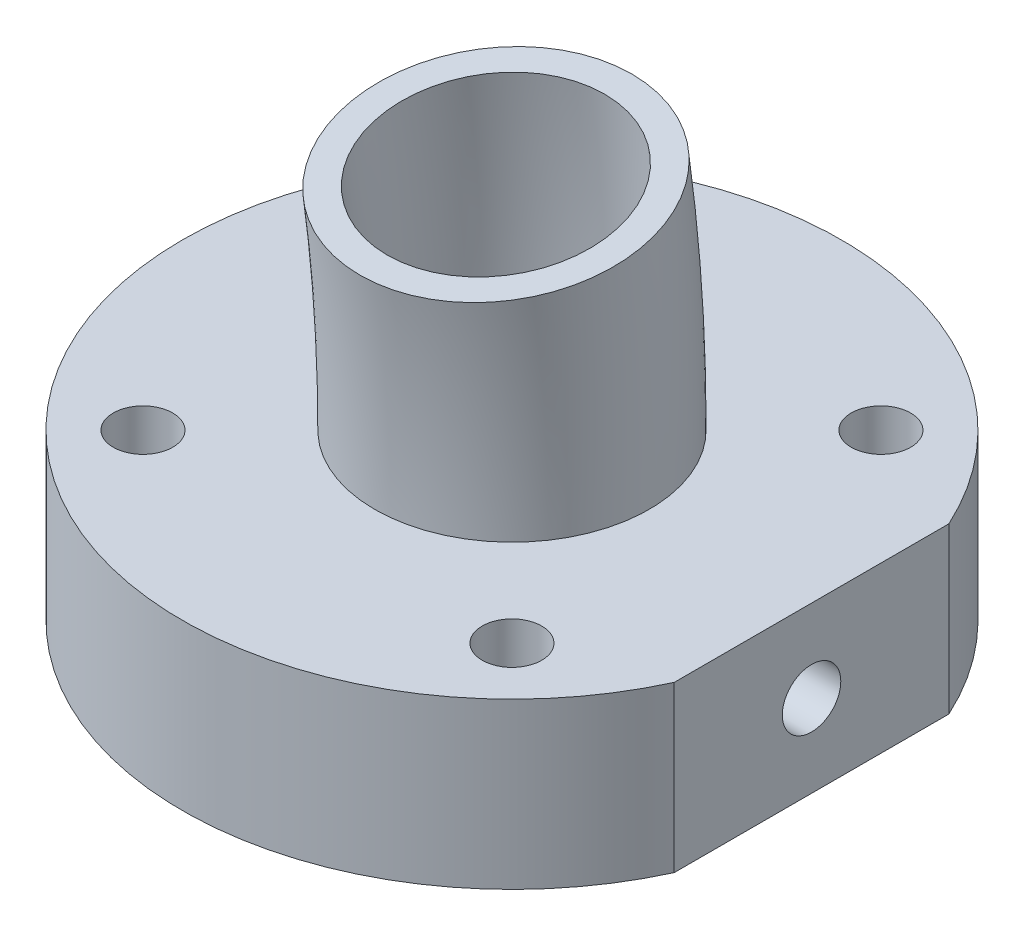
ISO-10303-21;
HEADER;
FILE_DESCRIPTION(('STEP AP214'),'2;1');
FILE_NAME('part.step','',(''),(''),'','','');
FILE_SCHEMA(('AUTOMOTIVE_DESIGN { 1 0 10303 214 1 1 1 1 }'));
ENDSEC;
DATA;
#1=APPLICATION_CONTEXT('core data for automotive mechanical design processes');
#2=APPLICATION_PROTOCOL_DEFINITION('international standard','automotive_design',2000,#1);
#3=PRODUCT_CONTEXT('',#1,'mechanical');
#4=PRODUCT('Part','Part','',(#3));
#5=PRODUCT_RELATED_PRODUCT_CATEGORY('part','',(#4));
#6=PRODUCT_DEFINITION_FORMATION('','',#4);
#7=PRODUCT_DEFINITION_CONTEXT('part definition',#1,'design');
#8=PRODUCT_DEFINITION('design','',#6,#7);
#9=PRODUCT_DEFINITION_SHAPE('','',#8);
#10=(LENGTH_UNIT() NAMED_UNIT(*) SI_UNIT(.MILLI.,.METRE.));
#11=(NAMED_UNIT(*) PLANE_ANGLE_UNIT() SI_UNIT($,.RADIAN.));
#12=(NAMED_UNIT(*) SI_UNIT($,.STERADIAN.) SOLID_ANGLE_UNIT());
#13=UNCERTAINTY_MEASURE_WITH_UNIT(LENGTH_MEASURE(1.E-05),#10,'distance_accuracy_value','');
#14=(GEOMETRIC_REPRESENTATION_CONTEXT(3) GLOBAL_UNCERTAINTY_ASSIGNED_CONTEXT((#13)) GLOBAL_UNIT_ASSIGNED_CONTEXT((#10,
#11,#12)) REPRESENTATION_CONTEXT('',''));
#15=CARTESIAN_POINT('',(0.,0.,0.));
#16=DIRECTION('',(0.,0.,1.));
#17=DIRECTION('',(1.,0.,0.));
#18=AXIS2_PLACEMENT_3D('',#15,#16,#17);
#19=CARTESIAN_POINT('',(27.7081287711747,15.24,12.7));
#20=DIRECTION('',(-1.,0.,0.));
#21=DIRECTION('',(0.,0.,1.));
#22=AXIS2_PLACEMENT_3D('',#19,#20,#21);
#23=PLANE('',#22);
#24=DIRECTION('',(0.,0.,-1.));
#25=VECTOR('',#24,1.);
#26=CARTESIAN_POINT('',(27.7081287711747,0.,12.7));
#27=LINE('',#26,#25);
#28=CARTESIAN_POINT('',(27.7081287711747,0.,12.7));
#29=VERTEX_POINT('',#28);
#30=CARTESIAN_POINT('',(27.7081287711747,0.,-12.7));
#31=VERTEX_POINT('',#30);
#32=EDGE_CURVE('E77',#29,#31,#27,.T.);
#33=ORIENTED_EDGE('',*,*,#32,.T.);
#34=DIRECTION('',(0.,-1.,0.));
#35=VECTOR('',#34,1.);
#36=CARTESIAN_POINT('',(27.7081287711747,15.24,-12.7));
#37=LINE('',#36,#35);
#38=CARTESIAN_POINT('',(27.7081287711747,15.24,-12.7));
#39=VERTEX_POINT('',#38);
#40=EDGE_CURVE('E73',#39,#31,#37,.T.);
#41=ORIENTED_EDGE('',*,*,#40,.F.);
#42=DIRECTION('',(0.,0.,-1.));
#43=VECTOR('',#42,1.);
#44=CARTESIAN_POINT('',(27.7081287711747,15.24,12.7));
#45=LINE('',#44,#43);
#46=CARTESIAN_POINT('',(27.7081287711747,15.24,12.7));
#47=VERTEX_POINT('',#46);
#48=EDGE_CURVE('E83',#47,#39,#45,.T.);
#49=ORIENTED_EDGE('',*,*,#48,.F.);
#50=DIRECTION('',(0.,-1.,0.));
#51=VECTOR('',#50,1.);
#52=CARTESIAN_POINT('',(27.7081287711747,15.24,12.7));
#53=LINE('',#52,#51);
#54=EDGE_CURVE('E67',#47,#29,#53,.T.);
#55=ORIENTED_EDGE('',*,*,#54,.T.);
#56=EDGE_LOOP('',(#33,#41,#49,#55));
#57=FACE_BOUND('',#56,.T.);
#58=CARTESIAN_POINT('',(27.7081287711747,7.62,0.));
#59=DIRECTION('',(1.,0.,0.));
#60=DIRECTION('',(0.,0.,-1.));
#61=AXIS2_PLACEMENT_3D('',#58,#59,#60);
#62=CIRCLE('',#61,2.7051);
#63=CARTESIAN_POINT('',(27.7081287711747,7.62,-2.7051));
#64=VERTEX_POINT('',#63);
#65=EDGE_CURVE('E210',#64,#64,#62,.T.);
#66=ORIENTED_EDGE('',*,*,#65,.F.);
#67=EDGE_LOOP('',(#66));
#68=FACE_BOUND('',#67,.T.);
#69=ADVANCED_FACE('F51',(#57,#68),#23,.F.);
#70=CARTESIAN_POINT('',(0.,15.24,0.));
#71=DIRECTION('',(0.,-1.,0.));
#72=DIRECTION('',(0.,0.,-1.));
#73=AXIS2_PLACEMENT_3D('',#70,#71,#72);
#74=CYLINDRICAL_SURFACE('',#73,30.48);
#75=CARTESIAN_POINT('',(0.,15.24,0.));
#76=DIRECTION('',(0.,1.,0.));
#77=DIRECTION('',(0.,0.,1.));
#78=AXIS2_PLACEMENT_3D('',#75,#76,#77);
#79=CIRCLE('',#78,30.48);
#80=EDGE_CURVE('E90',#39,#47,#79,.T.);
#81=ORIENTED_EDGE('',*,*,#80,.F.);
#82=ORIENTED_EDGE('',*,*,#40,.T.);
#83=CARTESIAN_POINT('',(0.,0.,0.));
#84=DIRECTION('',(0.,1.,0.));
#85=DIRECTION('',(0.,0.,1.));
#86=AXIS2_PLACEMENT_3D('',#83,#84,#85);
#87=CIRCLE('',#86,30.48);
#88=EDGE_CURVE('E88',#31,#29,#87,.T.);
#89=ORIENTED_EDGE('',*,*,#88,.T.);
#90=ORIENTED_EDGE('',*,*,#54,.F.);
#91=EDGE_LOOP('',(#81,#82,#89,#90));
#92=FACE_BOUND('',#91,.T.);
#93=ADVANCED_FACE('F53',(#92),#74,.T.);
#94=CARTESIAN_POINT('',(0.,15.24,0.));
#95=DIRECTION('',(0.,1.,0.));
#96=DIRECTION('',(0.,0.,1.));
#97=AXIS2_PLACEMENT_3D('',#94,#95,#96);
#98=PLANE('',#97);
#99=CARTESIAN_POINT('',(0.,15.24,0.));
#100=DIRECTION('',(0.,1.,0.));
#101=DIRECTION('',(0.,0.,1.));
#102=AXIS2_PLACEMENT_3D('',#99,#100,#101);
#103=CIRCLE('',#102,12.7);
#104=CARTESIAN_POINT('',(0.,15.24,-12.7));
#105=VERTEX_POINT('',#104);
#106=EDGE_CURVE('E197',#105,#105,#103,.T.);
#107=ORIENTED_EDGE('',*,*,#106,.F.);
#108=EDGE_LOOP('',(#107));
#109=FACE_BOUND('',#108,.T.);
#110=ORIENTED_EDGE('',*,*,#48,.T.);
#111=ORIENTED_EDGE('',*,*,#80,.T.);
#112=EDGE_LOOP('',(#110,#111));
#113=FACE_BOUND('',#112,.T.);
#114=CARTESIAN_POINT('',(-17.0624866300316,15.24,-17.0624866300312));
#115=DIRECTION('',(0.,-1.,0.));
#116=DIRECTION('',(0.,0.,-1.));
#117=AXIS2_PLACEMENT_3D('',#114,#115,#116);
#118=CIRCLE('',#117,2.75);
#119=CARTESIAN_POINT('',(-17.0624866300316,15.24,-19.8124866300312));
#120=VERTEX_POINT('',#119);
#121=EDGE_CURVE('E158',#120,#120,#118,.T.);
#122=ORIENTED_EDGE('',*,*,#121,.T.);
#123=EDGE_LOOP('',(#122));
#124=FACE_BOUND('',#123,.T.);
#125=CARTESIAN_POINT('',(17.0624866300314,15.24,-17.0624866300314));
#126=DIRECTION('',(0.,-1.,0.));
#127=DIRECTION('',(0.,0.,-1.));
#128=AXIS2_PLACEMENT_3D('',#125,#126,#127);
#129=CIRCLE('',#128,2.75);
#130=CARTESIAN_POINT('',(17.0624866300314,15.24,-19.8124866300314));
#131=VERTEX_POINT('',#130);
#132=EDGE_CURVE('E152',#131,#131,#129,.T.);
#133=ORIENTED_EDGE('',*,*,#132,.T.);
#134=EDGE_LOOP('',(#133));
#135=FACE_BOUND('',#134,.T.);
#136=CARTESIAN_POINT('',(17.0624866300315,15.24,17.0624866300313));
#137=DIRECTION('',(0.,-1.,0.));
#138=DIRECTION('',(0.,0.,-1.));
#139=AXIS2_PLACEMENT_3D('',#136,#137,#138);
#140=CIRCLE('',#139,2.75);
#141=CARTESIAN_POINT('',(17.0624866300315,15.24,14.3124866300313));
#142=VERTEX_POINT('',#141);
#143=EDGE_CURVE('E146',#142,#142,#140,.T.);
#144=ORIENTED_EDGE('',*,*,#143,.T.);
#145=EDGE_LOOP('',(#144));
#146=FACE_BOUND('',#145,.T.);
#147=CARTESIAN_POINT('',(-17.0624866300314,15.24,17.0624866300314));
#148=DIRECTION('',(0.,-1.,0.));
#149=DIRECTION('',(0.,0.,-1.));
#150=AXIS2_PLACEMENT_3D('',#147,#148,#149);
#151=CIRCLE('',#150,2.75);
#152=CARTESIAN_POINT('',(-17.0624866300314,15.24,14.3124866300314));
#153=VERTEX_POINT('',#152);
#154=EDGE_CURVE('E138',#153,#153,#151,.T.);
#155=ORIENTED_EDGE('',*,*,#154,.T.);
#156=EDGE_LOOP('',(#155));
#157=FACE_BOUND('',#156,.T.);
#158=ADVANCED_FACE('F113',(#109,#113,#124,#135,#146,#157),#98,.T.);
#159=CARTESIAN_POINT('',(0.,0.,0.));
#160=DIRECTION('',(0.,1.,0.));
#161=DIRECTION('',(0.,0.,1.));
#162=AXIS2_PLACEMENT_3D('',#159,#160,#161);
#163=PLANE('',#162);
#164=CARTESIAN_POINT('',(0.,0.,-22.86));
#165=DIRECTION('',(0.,1.,0.));
#166=DIRECTION('',(0.,0.,1.));
#167=AXIS2_PLACEMENT_3D('',#164,#165,#166);
#168=CIRCLE('',#167,2.54);
#169=CARTESIAN_POINT('',(0.,0.,-20.32));
#170=VERTEX_POINT('',#169);
#171=EDGE_CURVE('E11',#170,#170,#168,.F.);
#172=ORIENTED_EDGE('',*,*,#171,.F.);
#173=EDGE_LOOP('',(#172));
#174=FACE_BOUND('',#173,.T.);
#175=CARTESIAN_POINT('',(-21.7411519625072,0.,7.06412849141139));
#176=DIRECTION('',(0.,-1.,0.));
#177=DIRECTION('',(0.,0.,1.));
#178=AXIS2_PLACEMENT_3D('',#175,#176,#177);
#179=CIRCLE('',#178,2.5908);
#180=CARTESIAN_POINT('',(-21.7411519625072,0.,4.47332849141139));
#181=VERTEX_POINT('',#180);
#182=EDGE_CURVE('E178',#181,#181,#179,.T.);
#183=ORIENTED_EDGE('',*,*,#182,.F.);
#184=EDGE_LOOP('',(#183));
#185=FACE_BOUND('',#184,.T.);
#186=CARTESIAN_POINT('',(0.,0.,22.86));
#187=DIRECTION('',(0.,1.,0.));
#188=DIRECTION('',(0.,0.,1.));
#189=AXIS2_PLACEMENT_3D('',#186,#187,#188);
#190=CIRCLE('',#189,2.54);
#191=CARTESIAN_POINT('',(0.,0.,25.4));
#192=VERTEX_POINT('',#191);
#193=EDGE_CURVE('E60',#192,#192,#190,.F.);
#194=ORIENTED_EDGE('',*,*,#193,.F.);
#195=EDGE_LOOP('',(#194));
#196=FACE_BOUND('',#195,.T.);
#197=CARTESIAN_POINT('',(21.7411519625072,0.,-7.06412849141139));
#198=DIRECTION('',(0.,-1.,0.));
#199=DIRECTION('',(0.,0.,-1.));
#200=AXIS2_PLACEMENT_3D('',#197,#198,#199);
#201=CIRCLE('',#200,2.5908);
#202=CARTESIAN_POINT('',(21.7411519625072,0.,-9.65492849141139));
#203=VERTEX_POINT('',#202);
#204=EDGE_CURVE('E118',#203,#203,#201,.T.);
#205=ORIENTED_EDGE('',*,*,#204,.F.);
#206=EDGE_LOOP('',(#205));
#207=FACE_BOUND('',#206,.T.);
#208=CARTESIAN_POINT('',(-17.0624866300316,0.,-17.0624866300312));
#209=DIRECTION('',(0.,-1.,0.));
#210=DIRECTION('',(0.,0.,-1.));
#211=AXIS2_PLACEMENT_3D('',#208,#209,#210);
#212=CIRCLE('',#211,2.74999999999999);
#213=CARTESIAN_POINT('',(-17.0624866300316,0.,-19.8124866300312));
#214=VERTEX_POINT('',#213);
#215=EDGE_CURVE('E92',#214,#214,#212,.T.);
#216=ORIENTED_EDGE('',*,*,#215,.F.);
#217=EDGE_LOOP('',(#216));
#218=FACE_BOUND('',#217,.T.);
#219=CARTESIAN_POINT('',(17.0624866300314,0.,-17.0624866300314));
#220=DIRECTION('',(0.,-1.,0.));
#221=DIRECTION('',(0.,0.,-1.));
#222=AXIS2_PLACEMENT_3D('',#219,#220,#221);
#223=CIRCLE('',#222,2.74999999999999);
#224=CARTESIAN_POINT('',(17.0624866300314,0.,-19.8124866300314));
#225=VERTEX_POINT('',#224);
#226=EDGE_CURVE('E125',#225,#225,#223,.T.);
#227=ORIENTED_EDGE('',*,*,#226,.F.);
#228=EDGE_LOOP('',(#227));
#229=FACE_BOUND('',#228,.T.);
#230=CARTESIAN_POINT('',(17.0624866300315,0.,17.0624866300313));
#231=DIRECTION('',(0.,-1.,0.));
#232=DIRECTION('',(0.,0.,-1.));
#233=AXIS2_PLACEMENT_3D('',#230,#231,#232);
#234=CIRCLE('',#233,2.74999999999999);
#235=CARTESIAN_POINT('',(17.0624866300315,0.,14.3124866300313));
#236=VERTEX_POINT('',#235);
#237=EDGE_CURVE('E129',#236,#236,#234,.T.);
#238=ORIENTED_EDGE('',*,*,#237,.F.);
#239=EDGE_LOOP('',(#238));
#240=FACE_BOUND('',#239,.T.);
#241=CARTESIAN_POINT('',(-17.0624866300314,0.,17.0624866300314));
#242=DIRECTION('',(0.,-1.,0.));
#243=DIRECTION('',(0.,0.,-1.));
#244=AXIS2_PLACEMENT_3D('',#241,#242,#243);
#245=CIRCLE('',#244,2.74999999999999);
#246=CARTESIAN_POINT('',(-17.0624866300314,0.,14.3124866300314));
#247=VERTEX_POINT('',#246);
#248=EDGE_CURVE('E133',#247,#247,#245,.T.);
#249=ORIENTED_EDGE('',*,*,#248,.F.);
#250=EDGE_LOOP('',(#249));
#251=FACE_BOUND('',#250,.T.);
#252=CARTESIAN_POINT('',(0.,0.,0.));
#253=DIRECTION('',(0.,1.,0.));
#254=DIRECTION('',(0.,0.,1.));
#255=AXIS2_PLACEMENT_3D('',#252,#253,#254);
#256=CIRCLE('',#255,10.16);
#257=CARTESIAN_POINT('',(0.,0.,10.16));
#258=VERTEX_POINT('',#257);
#259=EDGE_CURVE('E102',#258,#258,#256,.T.);
#260=ORIENTED_EDGE('',*,*,#259,.T.);
#261=EDGE_LOOP('',(#260));
#262=FACE_BOUND('',#261,.T.);
#263=ORIENTED_EDGE('',*,*,#88,.F.);
#264=ORIENTED_EDGE('',*,*,#32,.F.);
#265=EDGE_LOOP('',(#263,#264));
#266=FACE_BOUND('',#265,.T.);
#267=ADVANCED_FACE('F94',(#174,#185,#196,#207,#218,#229,#240,#251,#262,#266),#163,.F.);
#268=CARTESIAN_POINT('',(0.,0.,0.));
#269=DIRECTION('',(0.,1.,0.));
#270=DIRECTION('',(0.,0.,1.));
#271=AXIS2_PLACEMENT_3D('',#268,#269,#270);
#272=CYLINDRICAL_SURFACE('',#271,10.16);
#273=CARTESIAN_POINT('',(9.79326472582049,7.62,-2.7051));
#274=CARTESIAN_POINT('',(9.7932673171211,7.76902770791751,-2.70509638863618));
#275=CARTESIAN_POINT('',(9.79670362492512,7.91809368698344,-2.69274283114542));
#276=CARTESIAN_POINT('',(9.81003660575043,8.21192123164599,-2.64374829179006));
#277=CARTESIAN_POINT('',(9.81993653309732,8.35668059052267,-2.60709507530541));
#278=CARTESIAN_POINT('',(9.8449978131649,8.63760184480197,-2.51079093511335));
#279=CARTESIAN_POINT('',(9.86015178054885,8.77377549282811,-2.45117227976283));
#280=CARTESIAN_POINT('',(9.89400425688689,9.03420908511249,-2.31073062232269));
#281=CARTESIAN_POINT('',(9.91270303800144,9.15846811349718,-2.229905991917));
#282=CARTESIAN_POINT('',(9.95206070242859,9.39464374035677,-2.04719172318244));
#283=CARTESIAN_POINT('',(9.97275425074444,9.50621926343222,-1.94486858829938));
#284=CARTESIAN_POINT('',(10.0134705647841,9.71084578731823,-1.7229942257539));
#285=CARTESIAN_POINT('',(10.0334932609663,9.80389487255655,-1.60344121878061));
#286=CARTESIAN_POINT('',(10.070998585387,9.97024878481681,-1.34813648253075));
#287=CARTESIAN_POINT('',(10.0884355517653,10.0432146335225,-1.21215658806797));
#288=CARTESIAN_POINT('',(10.1184070538741,10.1651203105704,-0.92931765340531));
#289=CARTESIAN_POINT('',(10.1309424135114,10.2140641770997,-0.782460446503641));
#290=CARTESIAN_POINT('',(10.1494531922373,10.2854329756945,-0.485595620147637));
#291=CARTESIAN_POINT('',(10.1555719025094,10.3084380735988,-0.335736568786069));
#292=CARTESIAN_POINT('',(10.1610609254403,10.3291015050557,-0.0341695538225296));
#293=CARTESIAN_POINT('',(10.1604323641952,10.3267640681882,0.117538097033137));
#294=CARTESIAN_POINT('',(10.1526026968424,10.2972175582547,0.41445806043396));
#295=CARTESIAN_POINT('',(10.145567236689,10.2706352918592,0.559737781017194));
#296=CARTESIAN_POINT('',(10.1259096831883,10.1943661961507,0.843694971494757));
#297=CARTESIAN_POINT('',(10.11328727179,10.1446780514699,0.982372065020202));
#298=CARTESIAN_POINT('',(10.0836281894883,10.0231265556663,1.2507889195354));
#299=CARTESIAN_POINT('',(10.0665489932574,9.95104822808549,1.38042643722773));
#300=CARTESIAN_POINT('',(10.029816857918,9.78692736717324,1.62597998706135));
#301=CARTESIAN_POINT('',(10.0101634187932,9.6948809529918,1.74189334509734));
#302=CARTESIAN_POINT('',(9.9697032157213,9.49010860868201,1.96044936613881));
#303=CARTESIAN_POINT('',(9.94887956305702,9.37683597438144,2.06257727447672));
#304=CARTESIAN_POINT('',(9.90896882434699,9.1345561771736,2.24651281866579));
#305=CARTESIAN_POINT('',(9.88988184354636,9.00554806177818,2.32831922352013));
#306=CARTESIAN_POINT('',(9.85553801299677,8.73434586248696,2.46967985871337));
#307=CARTESIAN_POINT('',(9.84030536141952,8.59207578993692,2.52909459638092));
#308=CARTESIAN_POINT('',(9.81569583938117,8.29905933215482,2.62299399517633));
#309=CARTESIAN_POINT('',(9.80631752203602,8.1483150513495,2.65748481652005));
#310=CARTESIAN_POINT('',(9.79478664059017,7.84744229166619,2.69967075476614));
#311=CARTESIAN_POINT('',(9.79242712964987,7.6974292632193,2.70813356040159));
#312=CARTESIAN_POINT('',(9.79463489133088,7.39813163229968,2.70013801063646));
#313=CARTESIAN_POINT('',(9.79920142938915,7.24884695426408,2.68368229804483));
#314=CARTESIAN_POINT('',(9.81454690118514,6.95819885472521,2.62699350870605));
#315=CARTESIAN_POINT('',(9.82520525874523,6.81673850994501,2.58722155152418));
#316=CARTESIAN_POINT('',(9.85141573404922,6.54249629647809,2.48554754715659));
#317=CARTESIAN_POINT('',(9.86696848935198,6.4097155611462,2.42364261672063));
#318=CARTESIAN_POINT('',(9.90164040357705,6.15338881863973,2.2779001256088));
#319=CARTESIAN_POINT('',(9.9208302652827,6.03010903658356,2.1936115454663));
#320=CARTESIAN_POINT('',(9.96044764353482,5.79916152035475,2.00605376371391));
#321=CARTESIAN_POINT('',(9.98087539150268,5.69149671823002,1.90278100565026));
#322=CARTESIAN_POINT('',(10.0213790155131,5.4916505323391,1.67663623714533));
#323=CARTESIAN_POINT('',(10.0414278127842,5.40000439051528,1.55328541546095));
#324=CARTESIAN_POINT('',(10.0783107077549,5.23871946386713,1.29250478628731));
#325=CARTESIAN_POINT('',(10.0951449765232,5.16907950780243,1.15507572860299));
#326=CARTESIAN_POINT('',(10.1235936291924,5.05442223124288,0.871006867777265));
#327=CARTESIAN_POINT('',(10.1352468318643,5.00922123150742,0.724445277449876));
#328=CARTESIAN_POINT('',(10.1521911656474,4.94419153916506,0.425450157750773));
#329=CARTESIAN_POINT('',(10.1574837018989,4.92435724271578,0.273017932947812));
#330=CARTESIAN_POINT('',(10.1610442586551,4.91097413481328,-0.02839025898668));
#331=CARTESIAN_POINT('',(10.1595221384301,4.91664006540924,-0.177329374587197));
#332=CARTESIAN_POINT('',(10.1500987588047,4.95227391508849,-0.472054187899851));
#333=CARTESIAN_POINT('',(10.1421977375863,4.9822409267936,-0.617840003144422));
#334=CARTESIAN_POINT('',(10.1209457384555,5.06518284960528,-0.901178475250264));
#335=CARTESIAN_POINT('',(10.1076324328625,5.11799887948469,-1.03878065425371));
#336=CARTESIAN_POINT('',(10.076948281487,5.24499767105314,-1.30324867864879));
#337=CARTESIAN_POINT('',(10.0595768681017,5.31918342203885,-1.4301130187667));
#338=CARTESIAN_POINT('',(10.0220589532015,5.48911654409842,-1.67316170275539));
#339=CARTESIAN_POINT('',(10.0018509358314,5.58538486659523,-1.78897229036808));
#340=CARTESIAN_POINT('',(9.96118703747031,5.79576178654122,-2.00306079102184));
#341=CARTESIAN_POINT('',(9.94073109271626,5.90987506728128,-2.10133408697913));
#342=CARTESIAN_POINT('',(9.9013716572321,6.1557097887659,-2.27968899872958));
#343=CARTESIAN_POINT('',(9.88251198493108,6.28776216371631,-2.35932500292422));
#344=CARTESIAN_POINT('',(9.84909844120408,6.56386723448478,-2.49515230618985));
#345=CARTESIAN_POINT('',(9.83454174706155,6.70791198355749,-2.55135898466771));
#346=CARTESIAN_POINT('',(9.81340992264055,6.97952712118093,-2.63134824475336));
#347=CARTESIAN_POINT('',(9.8059164860361,7.10591693301025,-2.65894033709995));
#348=CARTESIAN_POINT('',(9.79584304203194,7.36152844899186,-2.69581674451383));
#349=CARTESIAN_POINT('',(9.79326247841264,7.49074983088713,-2.70510313209798));
#350=CARTESIAN_POINT('',(9.79326472582049,7.62,-2.7051));
#351=B_SPLINE_CURVE_WITH_KNOTS('',3,(#273,#274,#275,#276,#277,#278,#279,#280,#281,#282,#283,
#284,#285,#286,#287,#288,#289,#290,#291,#292,#293,#294,#295,#296,#297,#298,#299,#300,#301,#302,
#303,#304,#305,#306,#307,#308,#309,#310,#311,#312,#313,#314,#315,#316,#317,#318,#319,#320,#321,
#322,#323,#324,#325,#326,#327,#328,#329,#330,#331,#332,#333,#334,#335,#336,#337,#338,#339,#340,
#341,#342,#343,#344,#345,#346,#347,#348,#349,#350),.UNSPECIFIED.,.T.,.F.,(4,2,2,2,2,2,2,2,2,2,2,
2,2,2,2,2,2,2,2,2,2,2,2,2,2,2,2,2,2,2,2,2,2,2,2,2,2,2,4),(0.,0.446607866413106,
0.893440766087151,1.33964810499296,1.78588971628344,2.24218332191288,2.69852408231549,
3.16215122234063,3.62570039815288,4.07866200184259,4.5315480089987,4.97304743922708,
5.41457200614561,5.86047416391406,6.30646306170138,6.766102171091,7.22576911682571,
7.6882540741525,8.1506246841794,8.59922027624953,9.04776829448714,9.48773124266103,
9.92775152546131,10.3774170686338,10.8271669371588,11.2898699752231,11.752548382586,
12.2116992489494,12.6707486652447,13.1157604310916,13.560755581407,14.0027049664123,
14.444716203414,14.8984825103401,15.3523681057025,15.8161954287924,16.2797178064747,
16.6670999888694,17.0544383104987),.UNSPECIFIED.);
#352=CARTESIAN_POINT('',(9.79326472582049,7.62,-2.7051));
#353=VERTEX_POINT('',#352);
#354=EDGE_CURVE('E201',#353,#353,#351,.T.);
#355=ORIENTED_EDGE('',*,*,#354,.T.);
#356=EDGE_LOOP('',(#355));
#357=FACE_BOUND('',#356,.T.);
#358=CARTESIAN_POINT('',(0.,15.24,0.));
#359=DIRECTION('',(0.,1.,0.));
#360=DIRECTION('',(0.,0.,1.));
#361=AXIS2_PLACEMENT_3D('',#358,#359,#360);
#362=CIRCLE('',#361,10.16);
#363=CARTESIAN_POINT('',(0.,15.24,-10.16));
#364=VERTEX_POINT('',#363);
#365=EDGE_CURVE('E96',#364,#364,#362,.T.);
#366=ORIENTED_EDGE('',*,*,#365,.T.);
#367=EDGE_LOOP('',(#366));
#368=FACE_BOUND('',#367,.T.);
#369=ORIENTED_EDGE('',*,*,#259,.F.);
#370=EDGE_LOOP('',(#369));
#371=FACE_BOUND('',#370,.T.);
#372=ADVANCED_FACE('F112',(#357,#368,#371),#272,.F.);
#373=CARTESIAN_POINT('',(-17.0624866300314,0.,17.0624866300314));
#374=DIRECTION('',(0.,-1.,0.));
#375=DIRECTION('',(0.,0.,-1.));
#376=AXIS2_PLACEMENT_3D('',#373,#374,#375);
#377=CYLINDRICAL_SURFACE('',#376,2.74999999999999);
#378=ORIENTED_EDGE('',*,*,#154,.F.);
#379=EDGE_LOOP('',(#378));
#380=FACE_BOUND('',#379,.T.);
#381=ORIENTED_EDGE('',*,*,#248,.T.);
#382=EDGE_LOOP('',(#381));
#383=FACE_BOUND('',#382,.T.);
#384=ADVANCED_FACE('F246',(#380,#383),#377,.F.);
#385=CARTESIAN_POINT('',(17.0624866300315,0.,17.0624866300313));
#386=DIRECTION('',(0.,-1.,0.));
#387=DIRECTION('',(0.,0.,-1.));
#388=AXIS2_PLACEMENT_3D('',#385,#386,#387);
#389=CYLINDRICAL_SURFACE('',#388,2.74999999999999);
#390=ORIENTED_EDGE('',*,*,#143,.F.);
#391=EDGE_LOOP('',(#390));
#392=FACE_BOUND('',#391,.T.);
#393=ORIENTED_EDGE('',*,*,#237,.T.);
#394=EDGE_LOOP('',(#393));
#395=FACE_BOUND('',#394,.T.);
#396=ADVANCED_FACE('F242',(#392,#395),#389,.F.);
#397=CARTESIAN_POINT('',(17.0624866300314,0.,-17.0624866300314));
#398=DIRECTION('',(0.,-1.,0.));
#399=DIRECTION('',(0.,0.,-1.));
#400=AXIS2_PLACEMENT_3D('',#397,#398,#399);
#401=CYLINDRICAL_SURFACE('',#400,2.74999999999999);
#402=ORIENTED_EDGE('',*,*,#132,.F.);
#403=EDGE_LOOP('',(#402));
#404=FACE_BOUND('',#403,.T.);
#405=ORIENTED_EDGE('',*,*,#226,.T.);
#406=EDGE_LOOP('',(#405));
#407=FACE_BOUND('',#406,.T.);
#408=ADVANCED_FACE('F238',(#404,#407),#401,.F.);
#409=CARTESIAN_POINT('',(-17.0624866300316,0.,-17.0624866300312));
#410=DIRECTION('',(0.,-1.,0.));
#411=DIRECTION('',(0.,0.,-1.));
#412=AXIS2_PLACEMENT_3D('',#409,#410,#411);
#413=CYLINDRICAL_SURFACE('',#412,2.74999999999999);
#414=ORIENTED_EDGE('',*,*,#121,.F.);
#415=EDGE_LOOP('',(#414));
#416=FACE_BOUND('',#415,.T.);
#417=ORIENTED_EDGE('',*,*,#215,.T.);
#418=EDGE_LOOP('',(#417));
#419=FACE_BOUND('',#418,.T.);
#420=ADVANCED_FACE('F235',(#416,#419),#413,.F.);
#421=CARTESIAN_POINT('',(21.7411519625072,3.81,-7.06412849141139));
#422=DIRECTION('',(0.,-1.,0.));
#423=DIRECTION('',(0.,0.,-1.));
#424=AXIS2_PLACEMENT_3D('',#421,#422,#423);
#425=CYLINDRICAL_SURFACE('',#424,2.5908);
#426=CARTESIAN_POINT('',(21.7411519625072,3.81,-7.06412849141139));
#427=DIRECTION('',(0.,-1.,0.));
#428=DIRECTION('',(0.,0.,-1.));
#429=AXIS2_PLACEMENT_3D('',#426,#427,#428);
#430=CIRCLE('',#429,2.5908);
#431=CARTESIAN_POINT('',(21.7411519625072,3.81,-9.65492849141139));
#432=VERTEX_POINT('',#431);
#433=EDGE_CURVE('E84',#432,#432,#430,.T.);
#434=CARTESIAN_POINT('',(21.7411519625072,3.81,-9.65492849141139));
#435=CARTESIAN_POINT('',(21.7411519625072,3.7703125,-9.65492849141139));
#436=CARTESIAN_POINT('',(21.7411519625072,3.730625,-9.65492849141139));
#437=CARTESIAN_POINT('',(21.7411519625072,3.65125,-9.65492849141139));
#438=CARTESIAN_POINT('',(21.7411519625072,3.6115625,-9.65492849141139));
#439=CARTESIAN_POINT('',(21.7411519625072,3.5321875,-9.65492849141139));
#440=CARTESIAN_POINT('',(21.7411519625072,3.4925,-9.65492849141139));
#441=CARTESIAN_POINT('',(21.7411519625072,3.413125,-9.65492849141139));
#442=CARTESIAN_POINT('',(21.7411519625072,3.3734375,-9.65492849141139));
#443=CARTESIAN_POINT('',(21.7411519625072,3.2940625,-9.65492849141139));
#444=CARTESIAN_POINT('',(21.7411519625072,3.254375,-9.65492849141139));
#445=CARTESIAN_POINT('',(21.7411519625072,3.175,-9.65492849141139));
#446=CARTESIAN_POINT('',(21.7411519625072,3.1353125,-9.65492849141139));
#447=CARTESIAN_POINT('',(21.7411519625072,3.0559375,-9.65492849141139));
#448=CARTESIAN_POINT('',(21.7411519625072,3.01625,-9.65492849141139));
#449=CARTESIAN_POINT('',(21.7411519625072,2.936875,-9.65492849141139));
#450=CARTESIAN_POINT('',(21.7411519625072,2.8971875,-9.65492849141139));
#451=CARTESIAN_POINT('',(21.7411519625072,2.8178125,-9.65492849141139));
#452=CARTESIAN_POINT('',(21.7411519625072,2.778125,-9.65492849141139));
#453=CARTESIAN_POINT('',(21.7411519625072,2.69875,-9.65492849141139));
#454=CARTESIAN_POINT('',(21.7411519625072,2.6590625,-9.65492849141139));
#455=CARTESIAN_POINT('',(21.7411519625072,2.5796875,-9.65492849141139));
#456=CARTESIAN_POINT('',(21.7411519625072,2.54,-9.65492849141139));
#457=CARTESIAN_POINT('',(21.7411519625072,2.460625,-9.65492849141139));
#458=CARTESIAN_POINT('',(21.7411519625072,2.4209375,-9.65492849141139));
#459=CARTESIAN_POINT('',(21.7411519625072,2.3415625,-9.65492849141139));
#460=CARTESIAN_POINT('',(21.7411519625072,2.301875,-9.65492849141139));
#461=CARTESIAN_POINT('',(21.7411519625072,2.2225,-9.65492849141139));
#462=CARTESIAN_POINT('',(21.7411519625072,2.1828125,-9.65492849141139));
#463=CARTESIAN_POINT('',(21.7411519625072,2.1034375,-9.65492849141139));
#464=CARTESIAN_POINT('',(21.7411519625072,2.06375,-9.65492849141139));
#465=CARTESIAN_POINT('',(21.7411519625072,1.984375,-9.65492849141139));
#466=CARTESIAN_POINT('',(21.7411519625072,1.9446875,-9.65492849141139));
#467=CARTESIAN_POINT('',(21.7411519625072,1.8653125,-9.65492849141139));
#468=CARTESIAN_POINT('',(21.7411519625072,1.825625,-9.65492849141139));
#469=CARTESIAN_POINT('',(21.7411519625072,1.74625,-9.65492849141139));
#470=CARTESIAN_POINT('',(21.7411519625072,1.7065625,-9.65492849141139));
#471=CARTESIAN_POINT('',(21.7411519625072,1.6271875,-9.65492849141139));
#472=CARTESIAN_POINT('',(21.7411519625072,1.5875,-9.65492849141139));
#473=CARTESIAN_POINT('',(21.7411519625072,1.508125,-9.65492849141139));
#474=CARTESIAN_POINT('',(21.7411519625072,1.4684375,-9.65492849141139));
#475=CARTESIAN_POINT('',(21.7411519625072,1.3890625,-9.65492849141139));
#476=CARTESIAN_POINT('',(21.7411519625072,1.349375,-9.65492849141139));
#477=CARTESIAN_POINT('',(21.7411519625072,1.27,-9.65492849141139));
#478=CARTESIAN_POINT('',(21.7411519625072,1.2303125,-9.65492849141139));
#479=CARTESIAN_POINT('',(21.7411519625072,1.1509375,-9.65492849141139));
#480=CARTESIAN_POINT('',(21.7411519625072,1.11125,-9.65492849141139));
#481=CARTESIAN_POINT('',(21.7411519625072,1.031875,-9.65492849141139));
#482=CARTESIAN_POINT('',(21.7411519625072,0.9921875,-9.65492849141139));
#483=CARTESIAN_POINT('',(21.7411519625072,0.9128125,-9.65492849141139));
#484=CARTESIAN_POINT('',(21.7411519625072,0.873125,-9.65492849141139));
#485=CARTESIAN_POINT('',(21.7411519625072,0.79375,-9.65492849141139));
#486=CARTESIAN_POINT('',(21.7411519625072,0.7540625,-9.65492849141139));
#487=CARTESIAN_POINT('',(21.7411519625072,0.6746875,-9.65492849141139));
#488=CARTESIAN_POINT('',(21.7411519625072,0.635,-9.65492849141139));
#489=CARTESIAN_POINT('',(21.7411519625072,0.555625,-9.65492849141139));
#490=CARTESIAN_POINT('',(21.7411519625072,0.5159375,-9.65492849141139));
#491=CARTESIAN_POINT('',(21.7411519625072,0.4365625,-9.65492849141139));
#492=CARTESIAN_POINT('',(21.7411519625072,0.396875,-9.65492849141139));
#493=CARTESIAN_POINT('',(21.7411519625072,0.3175,-9.65492849141139));
#494=CARTESIAN_POINT('',(21.7411519625072,0.2778125,-9.65492849141139));
#495=CARTESIAN_POINT('',(21.7411519625072,0.1984375,-9.65492849141139));
#496=CARTESIAN_POINT('',(21.7411519625072,0.15875,-9.65492849141139));
#497=CARTESIAN_POINT('',(21.7411519625072,0.0793749999999999,-9.65492849141139));
#498=CARTESIAN_POINT('',(21.7411519625072,0.0396874999999999,-9.65492849141139));
#499=CARTESIAN_POINT('',(21.7411519625072,0.,-9.65492849141139));
#500=B_SPLINE_CURVE_WITH_KNOTS('',3,(#434,#435,#436,#437,#438,#439,#440,#441,#442,#443,#444,
#445,#446,#447,#448,#449,#450,#451,#452,#453,#454,#455,#456,#457,#458,#459,#460,#461,#462,#463,
#464,#465,#466,#467,#468,#469,#470,#471,#472,#473,#474,#475,#476,#477,#478,#479,#480,#481,#482,
#483,#484,#485,#486,#487,#488,#489,#490,#491,#492,#493,#494,#495,#496,#497,#498,#499),
.UNSPECIFIED.,.F.,.F.,(4,2,2,2,2,2,2,2,2,2,2,2,2,2,2,2,2,2,2,2,2,2,2,2,2,2,2,2,2,2,2,2,4),(0.,
0.1190625,0.238125,0.3571875,0.47625,0.5953125,0.714375,0.8334375,0.9525,1.0715625,1.190625,
1.3096875,1.42875,1.5478125,1.666875,1.7859375,1.905,2.0240625,2.143125,2.2621875,2.38125,
2.5003125,2.619375,2.7384375,2.8575,2.9765625,3.095625,3.2146875,3.33375,3.4528125,3.571875,
3.6909375,3.81),.UNSPECIFIED.);
#501=EDGE_CURVE('BSEAM233',#432,#203,#500,.T.);
#502=ORIENTED_EDGE('',*,*,#433,.F.);
#503=ORIENTED_EDGE('',*,*,#204,.T.);
#504=ORIENTED_EDGE('',*,*,#501,.T.);
#505=ORIENTED_EDGE('',*,*,#501,.F.);
#506=EDGE_LOOP('',(#502,#504,#503,#505));
#507=FACE_BOUND('',#506,.T.);
#508=ADVANCED_FACE('F233',(#507),#425,.F.);
#509=CARTESIAN_POINT('',(21.7411519625072,3.81,-7.06412849141139));
#510=DIRECTION('',(0.,-1.,0.));
#511=DIRECTION('',(0.,0.,-1.));
#512=AXIS2_PLACEMENT_3D('',#509,#510,#511);
#513=PLANE('',#512);
#514=ORIENTED_EDGE('',*,*,#433,.T.);
#515=EDGE_LOOP('',(#514));
#516=FACE_BOUND('',#515,.T.);
#517=ADVANCED_FACE('F304',(#516),#513,.T.);
#518=CARTESIAN_POINT('',(0.,-3.81,22.86));
#519=DIRECTION('',(0.,1.,0.));
#520=DIRECTION('',(0.,0.,1.));
#521=AXIS2_PLACEMENT_3D('',#518,#519,#520);
#522=CYLINDRICAL_SURFACE('',#521,2.54);
#523=CARTESIAN_POINT('',(0.,-3.81,22.86));
#524=DIRECTION('',(0.,-1.,0.));
#525=DIRECTION('',(0.,0.,-1.));
#526=AXIS2_PLACEMENT_3D('',#523,#524,#525);
#527=CIRCLE('',#526,2.54);
#528=CARTESIAN_POINT('',(0.,-3.81,25.4));
#529=VERTEX_POINT('',#528);
#530=EDGE_CURVE('E170',#529,#529,#527,.T.);
#531=CARTESIAN_POINT('',(0.,-3.81,25.4));
#532=CARTESIAN_POINT('',(0.,-3.7703125,25.4));
#533=CARTESIAN_POINT('',(0.,-3.730625,25.4));
#534=CARTESIAN_POINT('',(0.,-3.65125,25.4));
#535=CARTESIAN_POINT('',(0.,-3.6115625,25.4));
#536=CARTESIAN_POINT('',(0.,-3.5321875,25.4));
#537=CARTESIAN_POINT('',(0.,-3.4925,25.4));
#538=CARTESIAN_POINT('',(0.,-3.413125,25.4));
#539=CARTESIAN_POINT('',(0.,-3.3734375,25.4));
#540=CARTESIAN_POINT('',(0.,-3.2940625,25.4));
#541=CARTESIAN_POINT('',(0.,-3.254375,25.4));
#542=CARTESIAN_POINT('',(0.,-3.175,25.4));
#543=CARTESIAN_POINT('',(0.,-3.1353125,25.4));
#544=CARTESIAN_POINT('',(0.,-3.0559375,25.4));
#545=CARTESIAN_POINT('',(0.,-3.01625,25.4));
#546=CARTESIAN_POINT('',(0.,-2.936875,25.4));
#547=CARTESIAN_POINT('',(0.,-2.8971875,25.4));
#548=CARTESIAN_POINT('',(0.,-2.8178125,25.4));
#549=CARTESIAN_POINT('',(0.,-2.778125,25.4));
#550=CARTESIAN_POINT('',(0.,-2.69875,25.4));
#551=CARTESIAN_POINT('',(0.,-2.6590625,25.4));
#552=CARTESIAN_POINT('',(0.,-2.5796875,25.4));
#553=CARTESIAN_POINT('',(0.,-2.54,25.4));
#554=CARTESIAN_POINT('',(0.,-2.460625,25.4));
#555=CARTESIAN_POINT('',(0.,-2.4209375,25.4));
#556=CARTESIAN_POINT('',(0.,-2.3415625,25.4));
#557=CARTESIAN_POINT('',(0.,-2.301875,25.4));
#558=CARTESIAN_POINT('',(0.,-2.2225,25.4));
#559=CARTESIAN_POINT('',(0.,-2.1828125,25.4));
#560=CARTESIAN_POINT('',(0.,-2.1034375,25.4));
#561=CARTESIAN_POINT('',(0.,-2.06375,25.4));
#562=CARTESIAN_POINT('',(0.,-1.984375,25.4));
#563=CARTESIAN_POINT('',(0.,-1.9446875,25.4));
#564=CARTESIAN_POINT('',(0.,-1.8653125,25.4));
#565=CARTESIAN_POINT('',(0.,-1.825625,25.4));
#566=CARTESIAN_POINT('',(0.,-1.74625,25.4));
#567=CARTESIAN_POINT('',(0.,-1.7065625,25.4));
#568=CARTESIAN_POINT('',(0.,-1.6271875,25.4));
#569=CARTESIAN_POINT('',(0.,-1.5875,25.4));
#570=CARTESIAN_POINT('',(0.,-1.508125,25.4));
#571=CARTESIAN_POINT('',(0.,-1.4684375,25.4));
#572=CARTESIAN_POINT('',(0.,-1.3890625,25.4));
#573=CARTESIAN_POINT('',(0.,-1.349375,25.4));
#574=CARTESIAN_POINT('',(0.,-1.27,25.4));
#575=CARTESIAN_POINT('',(0.,-1.2303125,25.4));
#576=CARTESIAN_POINT('',(0.,-1.1509375,25.4));
#577=CARTESIAN_POINT('',(0.,-1.11125,25.4));
#578=CARTESIAN_POINT('',(0.,-1.031875,25.4));
#579=CARTESIAN_POINT('',(0.,-0.9921875,25.4));
#580=CARTESIAN_POINT('',(0.,-0.9128125,25.4));
#581=CARTESIAN_POINT('',(0.,-0.873125,25.4));
#582=CARTESIAN_POINT('',(0.,-0.79375,25.4));
#583=CARTESIAN_POINT('',(0.,-0.7540625,25.4));
#584=CARTESIAN_POINT('',(0.,-0.6746875,25.4));
#585=CARTESIAN_POINT('',(0.,-0.635,25.4));
#586=CARTESIAN_POINT('',(0.,-0.555625,25.4));
#587=CARTESIAN_POINT('',(0.,-0.5159375,25.4));
#588=CARTESIAN_POINT('',(0.,-0.4365625,25.4));
#589=CARTESIAN_POINT('',(0.,-0.396875,25.4));
#590=CARTESIAN_POINT('',(0.,-0.3175,25.4));
#591=CARTESIAN_POINT('',(0.,-0.2778125,25.4));
#592=CARTESIAN_POINT('',(0.,-0.1984375,25.4));
#593=CARTESIAN_POINT('',(0.,-0.15875,25.4));
#594=CARTESIAN_POINT('',(0.,-0.0793749999999999,25.4));
#595=CARTESIAN_POINT('',(0.,-0.0396874999999999,25.4));
#596=CARTESIAN_POINT('',(0.,0.,25.4));
#597=B_SPLINE_CURVE_WITH_KNOTS('',3,(#531,#532,#533,#534,#535,#536,#537,#538,#539,#540,#541,
#542,#543,#544,#545,#546,#547,#548,#549,#550,#551,#552,#553,#554,#555,#556,#557,#558,#559,#560,
#561,#562,#563,#564,#565,#566,#567,#568,#569,#570,#571,#572,#573,#574,#575,#576,#577,#578,#579,
#580,#581,#582,#583,#584,#585,#586,#587,#588,#589,#590,#591,#592,#593,#594,#595,#596),
.UNSPECIFIED.,.F.,.F.,(4,2,2,2,2,2,2,2,2,2,2,2,2,2,2,2,2,2,2,2,2,2,2,2,2,2,2,2,2,2,2,2,4),(0.,
0.1190625,0.238125,0.3571875,0.47625,0.5953125,0.714375,0.8334375,0.9525,1.0715625,1.190625,
1.3096875,1.42875,1.5478125,1.666875,1.7859375,1.905,2.0240625,2.143125,2.2621875,2.38125,
2.5003125,2.619375,2.7384375,2.8575,2.9765625,3.095625,3.2146875,3.33375,3.4528125,3.571875,
3.6909375,3.81),.UNSPECIFIED.);
#598=EDGE_CURVE('BSEAM108',#529,#192,#597,.T.);
#599=ORIENTED_EDGE('',*,*,#530,.F.);
#600=ORIENTED_EDGE('',*,*,#193,.T.);
#601=ORIENTED_EDGE('',*,*,#598,.T.);
#602=ORIENTED_EDGE('',*,*,#598,.F.);
#603=EDGE_LOOP('',(#599,#601,#600,#602));
#604=FACE_BOUND('',#603,.T.);
#605=ADVANCED_FACE('F108',(#604),#522,.T.);
#606=CARTESIAN_POINT('',(0.,-3.81,22.86));
#607=DIRECTION('',(0.,-1.,0.));
#608=DIRECTION('',(0.,0.,-1.));
#609=AXIS2_PLACEMENT_3D('',#606,#607,#608);
#610=PLANE('',#609);
#611=ORIENTED_EDGE('',*,*,#530,.T.);
#612=EDGE_LOOP('',(#611));
#613=FACE_BOUND('',#612,.T.);
#614=ADVANCED_FACE('F298',(#613),#610,.T.);
#615=CARTESIAN_POINT('',(-21.7411519625072,3.81,7.06412849141139));
#616=DIRECTION('',(0.,-1.,0.));
#617=DIRECTION('',(0.,0.,-1.));
#618=AXIS2_PLACEMENT_3D('',#615,#616,#617);
#619=CYLINDRICAL_SURFACE('',#618,2.5908);
#620=CARTESIAN_POINT('',(-21.7411519625072,3.81,7.06412849141139));
#621=DIRECTION('',(0.,-1.,0.));
#622=DIRECTION('',(0.,0.,1.));
#623=AXIS2_PLACEMENT_3D('',#620,#621,#622);
#624=CIRCLE('',#623,2.5908);
#625=CARTESIAN_POINT('',(-21.7411519625072,3.81,4.47332849141139));
#626=VERTEX_POINT('',#625);
#627=EDGE_CURVE('E177',#626,#626,#624,.T.);
#628=CARTESIAN_POINT('',(-21.7411519625072,3.81,4.47332849141139));
#629=CARTESIAN_POINT('',(-21.7411519625072,3.7703125,4.47332849141139));
#630=CARTESIAN_POINT('',(-21.7411519625072,3.730625,4.47332849141139));
#631=CARTESIAN_POINT('',(-21.7411519625072,3.65125,4.47332849141139));
#632=CARTESIAN_POINT('',(-21.7411519625072,3.6115625,4.47332849141139));
#633=CARTESIAN_POINT('',(-21.7411519625072,3.5321875,4.47332849141139));
#634=CARTESIAN_POINT('',(-21.7411519625072,3.4925,4.47332849141139));
#635=CARTESIAN_POINT('',(-21.7411519625072,3.413125,4.47332849141139));
#636=CARTESIAN_POINT('',(-21.7411519625072,3.3734375,4.47332849141139));
#637=CARTESIAN_POINT('',(-21.7411519625072,3.2940625,4.47332849141139));
#638=CARTESIAN_POINT('',(-21.7411519625072,3.254375,4.47332849141139));
#639=CARTESIAN_POINT('',(-21.7411519625072,3.175,4.47332849141139));
#640=CARTESIAN_POINT('',(-21.7411519625072,3.1353125,4.47332849141139));
#641=CARTESIAN_POINT('',(-21.7411519625072,3.0559375,4.47332849141139));
#642=CARTESIAN_POINT('',(-21.7411519625072,3.01625,4.47332849141139));
#643=CARTESIAN_POINT('',(-21.7411519625072,2.936875,4.47332849141139));
#644=CARTESIAN_POINT('',(-21.7411519625072,2.8971875,4.47332849141139));
#645=CARTESIAN_POINT('',(-21.7411519625072,2.8178125,4.47332849141139));
#646=CARTESIAN_POINT('',(-21.7411519625072,2.778125,4.47332849141139));
#647=CARTESIAN_POINT('',(-21.7411519625072,2.69875,4.47332849141139));
#648=CARTESIAN_POINT('',(-21.7411519625072,2.6590625,4.47332849141139));
#649=CARTESIAN_POINT('',(-21.7411519625072,2.5796875,4.47332849141139));
#650=CARTESIAN_POINT('',(-21.7411519625072,2.54,4.47332849141139));
#651=CARTESIAN_POINT('',(-21.7411519625072,2.460625,4.47332849141139));
#652=CARTESIAN_POINT('',(-21.7411519625072,2.4209375,4.47332849141139));
#653=CARTESIAN_POINT('',(-21.7411519625072,2.3415625,4.47332849141139));
#654=CARTESIAN_POINT('',(-21.7411519625072,2.301875,4.47332849141139));
#655=CARTESIAN_POINT('',(-21.7411519625072,2.2225,4.47332849141139));
#656=CARTESIAN_POINT('',(-21.7411519625072,2.1828125,4.47332849141139));
#657=CARTESIAN_POINT('',(-21.7411519625072,2.1034375,4.47332849141139));
#658=CARTESIAN_POINT('',(-21.7411519625072,2.06375,4.47332849141139));
#659=CARTESIAN_POINT('',(-21.7411519625072,1.984375,4.47332849141139));
#660=CARTESIAN_POINT('',(-21.7411519625072,1.9446875,4.47332849141139));
#661=CARTESIAN_POINT('',(-21.7411519625072,1.8653125,4.47332849141139));
#662=CARTESIAN_POINT('',(-21.7411519625072,1.825625,4.47332849141139));
#663=CARTESIAN_POINT('',(-21.7411519625072,1.74625,4.47332849141139));
#664=CARTESIAN_POINT('',(-21.7411519625072,1.7065625,4.47332849141139));
#665=CARTESIAN_POINT('',(-21.7411519625072,1.6271875,4.47332849141139));
#666=CARTESIAN_POINT('',(-21.7411519625072,1.5875,4.47332849141139));
#667=CARTESIAN_POINT('',(-21.7411519625072,1.508125,4.47332849141139));
#668=CARTESIAN_POINT('',(-21.7411519625072,1.4684375,4.47332849141139));
#669=CARTESIAN_POINT('',(-21.7411519625072,1.3890625,4.47332849141139));
#670=CARTESIAN_POINT('',(-21.7411519625072,1.349375,4.47332849141139));
#671=CARTESIAN_POINT('',(-21.7411519625072,1.27,4.47332849141139));
#672=CARTESIAN_POINT('',(-21.7411519625072,1.2303125,4.47332849141139));
#673=CARTESIAN_POINT('',(-21.7411519625072,1.1509375,4.47332849141139));
#674=CARTESIAN_POINT('',(-21.7411519625072,1.11125,4.47332849141139));
#675=CARTESIAN_POINT('',(-21.7411519625072,1.031875,4.47332849141139));
#676=CARTESIAN_POINT('',(-21.7411519625072,0.9921875,4.47332849141139));
#677=CARTESIAN_POINT('',(-21.7411519625072,0.9128125,4.47332849141139));
#678=CARTESIAN_POINT('',(-21.7411519625072,0.873125,4.47332849141139));
#679=CARTESIAN_POINT('',(-21.7411519625072,0.79375,4.47332849141139));
#680=CARTESIAN_POINT('',(-21.7411519625072,0.7540625,4.47332849141139));
#681=CARTESIAN_POINT('',(-21.7411519625072,0.6746875,4.47332849141139));
#682=CARTESIAN_POINT('',(-21.7411519625072,0.635,4.47332849141139));
#683=CARTESIAN_POINT('',(-21.7411519625072,0.555625,4.47332849141139));
#684=CARTESIAN_POINT('',(-21.7411519625072,0.5159375,4.47332849141139));
#685=CARTESIAN_POINT('',(-21.7411519625072,0.4365625,4.47332849141139));
#686=CARTESIAN_POINT('',(-21.7411519625072,0.396875,4.47332849141139));
#687=CARTESIAN_POINT('',(-21.7411519625072,0.3175,4.47332849141139));
#688=CARTESIAN_POINT('',(-21.7411519625072,0.2778125,4.47332849141139));
#689=CARTESIAN_POINT('',(-21.7411519625072,0.1984375,4.47332849141139));
#690=CARTESIAN_POINT('',(-21.7411519625072,0.15875,4.47332849141139));
#691=CARTESIAN_POINT('',(-21.7411519625072,0.0793749999999999,4.47332849141139));
#692=CARTESIAN_POINT('',(-21.7411519625072,0.0396874999999999,4.47332849141139));
#693=CARTESIAN_POINT('',(-21.7411519625072,0.,4.47332849141139));
#694=B_SPLINE_CURVE_WITH_KNOTS('',3,(#628,#629,#630,#631,#632,#633,#634,#635,#636,#637,#638,
#639,#640,#641,#642,#643,#644,#645,#646,#647,#648,#649,#650,#651,#652,#653,#654,#655,#656,#657,
#658,#659,#660,#661,#662,#663,#664,#665,#666,#667,#668,#669,#670,#671,#672,#673,#674,#675,#676,
#677,#678,#679,#680,#681,#682,#683,#684,#685,#686,#687,#688,#689,#690,#691,#692,#693),
.UNSPECIFIED.,.F.,.F.,(4,2,2,2,2,2,2,2,2,2,2,2,2,2,2,2,2,2,2,2,2,2,2,2,2,2,2,2,2,2,2,2,4),(0.,
0.1190625,0.238125,0.3571875,0.47625,0.5953125,0.714375,0.8334375,0.9525,1.0715625,1.190625,
1.3096875,1.42875,1.5478125,1.666875,1.7859375,1.905,2.0240625,2.143125,2.2621875,2.38125,
2.5003125,2.619375,2.7384375,2.8575,2.9765625,3.095625,3.2146875,3.33375,3.4528125,3.571875,
3.6909375,3.81),.UNSPECIFIED.);
#695=EDGE_CURVE('BSEAM294',#626,#181,#694,.T.);
#696=ORIENTED_EDGE('',*,*,#627,.F.);
#697=ORIENTED_EDGE('',*,*,#182,.T.);
#698=ORIENTED_EDGE('',*,*,#695,.T.);
#699=ORIENTED_EDGE('',*,*,#695,.F.);
#700=EDGE_LOOP('',(#696,#698,#697,#699));
#701=FACE_BOUND('',#700,.T.);
#702=ADVANCED_FACE('F294',(#701),#619,.F.);
#703=CARTESIAN_POINT('',(-21.7411519625072,3.81,7.06412849141139));
#704=DIRECTION('',(0.,-1.,0.));
#705=DIRECTION('',(0.,0.,1.));
#706=AXIS2_PLACEMENT_3D('',#703,#704,#705);
#707=PLANE('',#706);
#708=ORIENTED_EDGE('',*,*,#627,.T.);
#709=EDGE_LOOP('',(#708));
#710=FACE_BOUND('',#709,.T.);
#711=ADVANCED_FACE('F290',(#710),#707,.T.);
#712=CARTESIAN_POINT('',(0.,-3.81,-22.86));
#713=DIRECTION('',(0.,1.,0.));
#714=DIRECTION('',(0.,0.,1.));
#715=AXIS2_PLACEMENT_3D('',#712,#713,#714);
#716=CYLINDRICAL_SURFACE('',#715,2.54);
#717=CARTESIAN_POINT('',(0.,-3.81,-22.86));
#718=DIRECTION('',(0.,-1.,0.));
#719=DIRECTION('',(0.,0.,1.));
#720=AXIS2_PLACEMENT_3D('',#717,#718,#719);
#721=CIRCLE('',#720,2.54);
#722=CARTESIAN_POINT('',(0.,-3.81,-20.32));
#723=VERTEX_POINT('',#722);
#724=EDGE_CURVE('E182',#723,#723,#721,.T.);
#725=CARTESIAN_POINT('',(0.,-3.81,-20.32));
#726=CARTESIAN_POINT('',(0.,-3.7703125,-20.32));
#727=CARTESIAN_POINT('',(0.,-3.730625,-20.32));
#728=CARTESIAN_POINT('',(0.,-3.65125,-20.32));
#729=CARTESIAN_POINT('',(0.,-3.6115625,-20.32));
#730=CARTESIAN_POINT('',(0.,-3.5321875,-20.32));
#731=CARTESIAN_POINT('',(0.,-3.4925,-20.32));
#732=CARTESIAN_POINT('',(0.,-3.413125,-20.32));
#733=CARTESIAN_POINT('',(0.,-3.3734375,-20.32));
#734=CARTESIAN_POINT('',(0.,-3.2940625,-20.32));
#735=CARTESIAN_POINT('',(0.,-3.254375,-20.32));
#736=CARTESIAN_POINT('',(0.,-3.175,-20.32));
#737=CARTESIAN_POINT('',(0.,-3.1353125,-20.32));
#738=CARTESIAN_POINT('',(0.,-3.0559375,-20.32));
#739=CARTESIAN_POINT('',(0.,-3.01625,-20.32));
#740=CARTESIAN_POINT('',(0.,-2.936875,-20.32));
#741=CARTESIAN_POINT('',(0.,-2.8971875,-20.32));
#742=CARTESIAN_POINT('',(0.,-2.8178125,-20.32));
#743=CARTESIAN_POINT('',(0.,-2.778125,-20.32));
#744=CARTESIAN_POINT('',(0.,-2.69875,-20.32));
#745=CARTESIAN_POINT('',(0.,-2.6590625,-20.32));
#746=CARTESIAN_POINT('',(0.,-2.5796875,-20.32));
#747=CARTESIAN_POINT('',(0.,-2.54,-20.32));
#748=CARTESIAN_POINT('',(0.,-2.460625,-20.32));
#749=CARTESIAN_POINT('',(0.,-2.4209375,-20.32));
#750=CARTESIAN_POINT('',(0.,-2.3415625,-20.32));
#751=CARTESIAN_POINT('',(0.,-2.301875,-20.32));
#752=CARTESIAN_POINT('',(0.,-2.2225,-20.32));
#753=CARTESIAN_POINT('',(0.,-2.1828125,-20.32));
#754=CARTESIAN_POINT('',(0.,-2.1034375,-20.32));
#755=CARTESIAN_POINT('',(0.,-2.06375,-20.32));
#756=CARTESIAN_POINT('',(0.,-1.984375,-20.32));
#757=CARTESIAN_POINT('',(0.,-1.9446875,-20.32));
#758=CARTESIAN_POINT('',(0.,-1.8653125,-20.32));
#759=CARTESIAN_POINT('',(0.,-1.825625,-20.32));
#760=CARTESIAN_POINT('',(0.,-1.74625,-20.32));
#761=CARTESIAN_POINT('',(0.,-1.7065625,-20.32));
#762=CARTESIAN_POINT('',(0.,-1.6271875,-20.32));
#763=CARTESIAN_POINT('',(0.,-1.5875,-20.32));
#764=CARTESIAN_POINT('',(0.,-1.508125,-20.32));
#765=CARTESIAN_POINT('',(0.,-1.4684375,-20.32));
#766=CARTESIAN_POINT('',(0.,-1.3890625,-20.32));
#767=CARTESIAN_POINT('',(0.,-1.349375,-20.32));
#768=CARTESIAN_POINT('',(0.,-1.27,-20.32));
#769=CARTESIAN_POINT('',(0.,-1.2303125,-20.32));
#770=CARTESIAN_POINT('',(0.,-1.1509375,-20.32));
#771=CARTESIAN_POINT('',(0.,-1.11125,-20.32));
#772=CARTESIAN_POINT('',(0.,-1.031875,-20.32));
#773=CARTESIAN_POINT('',(0.,-0.9921875,-20.32));
#774=CARTESIAN_POINT('',(0.,-0.9128125,-20.32));
#775=CARTESIAN_POINT('',(0.,-0.873125,-20.32));
#776=CARTESIAN_POINT('',(0.,-0.79375,-20.32));
#777=CARTESIAN_POINT('',(0.,-0.7540625,-20.32));
#778=CARTESIAN_POINT('',(0.,-0.6746875,-20.32));
#779=CARTESIAN_POINT('',(0.,-0.635,-20.32));
#780=CARTESIAN_POINT('',(0.,-0.555625,-20.32));
#781=CARTESIAN_POINT('',(0.,-0.5159375,-20.32));
#782=CARTESIAN_POINT('',(0.,-0.4365625,-20.32));
#783=CARTESIAN_POINT('',(0.,-0.396875,-20.32));
#784=CARTESIAN_POINT('',(0.,-0.3175,-20.32));
#785=CARTESIAN_POINT('',(0.,-0.2778125,-20.32));
#786=CARTESIAN_POINT('',(0.,-0.1984375,-20.32));
#787=CARTESIAN_POINT('',(0.,-0.15875,-20.32));
#788=CARTESIAN_POINT('',(0.,-0.0793749999999999,-20.32));
#789=CARTESIAN_POINT('',(0.,-0.0396874999999999,-20.32));
#790=CARTESIAN_POINT('',(0.,0.,-20.32));
#791=B_SPLINE_CURVE_WITH_KNOTS('',3,(#725,#726,#727,#728,#729,#730,#731,#732,#733,#734,#735,
#736,#737,#738,#739,#740,#741,#742,#743,#744,#745,#746,#747,#748,#749,#750,#751,#752,#753,#754,
#755,#756,#757,#758,#759,#760,#761,#762,#763,#764,#765,#766,#767,#768,#769,#770,#771,#772,#773,
#774,#775,#776,#777,#778,#779,#780,#781,#782,#783,#784,#785,#786,#787,#788,#789,#790),
.UNSPECIFIED.,.F.,.F.,(4,2,2,2,2,2,2,2,2,2,2,2,2,2,2,2,2,2,2,2,2,2,2,2,2,2,2,2,2,2,2,2,4),(0.,
0.1190625,0.238125,0.3571875,0.47625,0.5953125,0.714375,0.8334375,0.9525,1.0715625,1.190625,
1.3096875,1.42875,1.5478125,1.666875,1.7859375,1.905,2.0240625,2.143125,2.2621875,2.38125,
2.5003125,2.619375,2.7384375,2.8575,2.9765625,3.095625,3.2146875,3.33375,3.4528125,3.571875,
3.6909375,3.81),.UNSPECIFIED.);
#792=EDGE_CURVE('BSEAM286',#723,#170,#791,.T.);
#793=ORIENTED_EDGE('',*,*,#724,.F.);
#794=ORIENTED_EDGE('',*,*,#171,.T.);
#795=ORIENTED_EDGE('',*,*,#792,.T.);
#796=ORIENTED_EDGE('',*,*,#792,.F.);
#797=EDGE_LOOP('',(#793,#795,#794,#796));
#798=FACE_BOUND('',#797,.T.);
#799=ADVANCED_FACE('F286',(#798),#716,.T.);
#800=CARTESIAN_POINT('',(0.,-3.81,-22.86));
#801=DIRECTION('',(0.,-1.,0.));
#802=DIRECTION('',(0.,0.,1.));
#803=AXIS2_PLACEMENT_3D('',#800,#801,#802);
#804=PLANE('',#803);
#805=ORIENTED_EDGE('',*,*,#724,.T.);
#806=EDGE_LOOP('',(#805));
#807=FACE_BOUND('',#806,.T.);
#808=ADVANCED_FACE('F280',(#807),#804,.T.);
#809=CARTESIAN_POINT('',(0.,15.24,152.4));
#810=DIRECTION('',(-1.,0.,0.));
#811=DIRECTION('',(0.,0.,1.));
#812=AXIS2_PLACEMENT_3D('',#809,#810,#811);
#813=TOROIDAL_SURFACE('',#812,152.4,10.16);
#814=CARTESIAN_POINT('',(0.,36.449980586314,1.48314632378469));
#815=DIRECTION('',(0.,0.99026806874157,0.139173100960066));
#816=DIRECTION('',(0.,-0.139173100960066,0.99026806874157));
#817=AXIS2_PLACEMENT_3D('',#814,#815,#816);
#818=CIRCLE('',#817,10.16);
#819=CARTESIAN_POINT('',(0.,37.8639792920683,-8.57797725462967));
#820=VERTEX_POINT('',#819);
#821=EDGE_CURVE('E193',#820,#820,#818,.T.);
#822=CARTESIAN_POINT('',(0.,15.24,152.4));
#823=DIRECTION('',(-1.,0.,0.));
#824=DIRECTION('',(0.,0.,1.));
#825=AXIS2_PLACEMENT_3D('',#822,#823,#824);
#826=CIRCLE('',#825,162.56);
#827=EDGE_CURVE('',#820,#364,#826,.T.);
#828=ORIENTED_EDGE('',*,*,#821,.T.);
#829=ORIENTED_EDGE('',*,*,#365,.F.);
#830=ORIENTED_EDGE('',*,*,#827,.T.);
#831=ORIENTED_EDGE('',*,*,#827,.F.);
#832=EDGE_LOOP('',(#828,#830,#829,#831));
#833=FACE_BOUND('',#832,.T.);
#834=ADVANCED_FACE('F275',(#833),#813,.F.);
#835=CARTESIAN_POINT('',(0.,15.24,152.4));
#836=DIRECTION('',(-1.,0.,0.));
#837=DIRECTION('',(0.,0.,1.));
#838=AXIS2_PLACEMENT_3D('',#835,#836,#837);
#839=TOROIDAL_SURFACE('',#838,152.4,12.7);
#840=CARTESIAN_POINT('',(0.,36.449980586314,1.48314632378469));
#841=DIRECTION('',(0.,0.99026806874157,0.139173100960066));
#842=DIRECTION('',(0.,-0.139173100960066,0.99026806874157));
#843=AXIS2_PLACEMENT_3D('',#840,#841,#842);
#844=CIRCLE('',#843,12.7);
#845=CARTESIAN_POINT('',(0.,38.2174789685069,-11.0932581492332));
#846=VERTEX_POINT('',#845);
#847=EDGE_CURVE('E189',#846,#846,#844,.T.);
#848=CARTESIAN_POINT('',(0.,15.24,152.4));
#849=DIRECTION('',(-1.,0.,0.));
#850=DIRECTION('',(0.,0.,1.));
#851=AXIS2_PLACEMENT_3D('',#848,#849,#850);
#852=CIRCLE('',#851,165.1);
#853=EDGE_CURVE('',#846,#105,#852,.T.);
#854=ORIENTED_EDGE('',*,*,#847,.F.);
#855=ORIENTED_EDGE('',*,*,#106,.T.);
#856=ORIENTED_EDGE('',*,*,#853,.T.);
#857=ORIENTED_EDGE('',*,*,#853,.F.);
#858=EDGE_LOOP('',(#854,#856,#855,#857));
#859=FACE_BOUND('',#858,.T.);
#860=ADVANCED_FACE('F221',(#859),#839,.T.);
#861=CARTESIAN_POINT('',(0.,36.449980586314,1.48314632378469));
#862=DIRECTION('',(0.,0.99026806874157,0.139173100960066));
#863=DIRECTION('',(0.,-0.139173100960066,0.99026806874157));
#864=AXIS2_PLACEMENT_3D('',#861,#862,#863);
#865=PLANE('',#864);
#866=ORIENTED_EDGE('',*,*,#821,.F.);
#867=EDGE_LOOP('',(#866));
#868=FACE_BOUND('',#867,.T.);
#869=ORIENTED_EDGE('',*,*,#847,.T.);
#870=EDGE_LOOP('',(#869));
#871=FACE_BOUND('',#870,.T.);
#872=ADVANCED_FACE('F216',(#868,#871),#865,.T.);
#873=CARTESIAN_POINT('',(27.7081287711747,7.62,0.));
#874=DIRECTION('',(1.,0.,0.));
#875=DIRECTION('',(0.,0.,-1.));
#876=AXIS2_PLACEMENT_3D('',#873,#874,#875);
#877=CYLINDRICAL_SURFACE('',#876,2.7051);
#878=ORIENTED_EDGE('',*,*,#354,.F.);
#879=EDGE_LOOP('',(#878));
#880=FACE_BOUND('',#879,.T.);
#881=ORIENTED_EDGE('',*,*,#65,.T.);
#882=EDGE_LOOP('',(#881));
#883=FACE_BOUND('',#882,.T.);
#884=ADVANCED_FACE('F213',(#880,#883),#877,.F.);
#885=CLOSED_SHELL('',(#69,#93,#158,#267,#372,#384,#396,#408,#420,#508,#517,#605,#614,#702,#711,
#799,#808,#834,#860,#872,#884));
#886=MANIFOLD_SOLID_BREP('B2',#885);
#887=ADVANCED_BREP_SHAPE_REPRESENTATION('',(#18,#886),#14);
#888=SHAPE_DEFINITION_REPRESENTATION(#9,#887);
ENDSEC;
END-ISO-10303-21;
